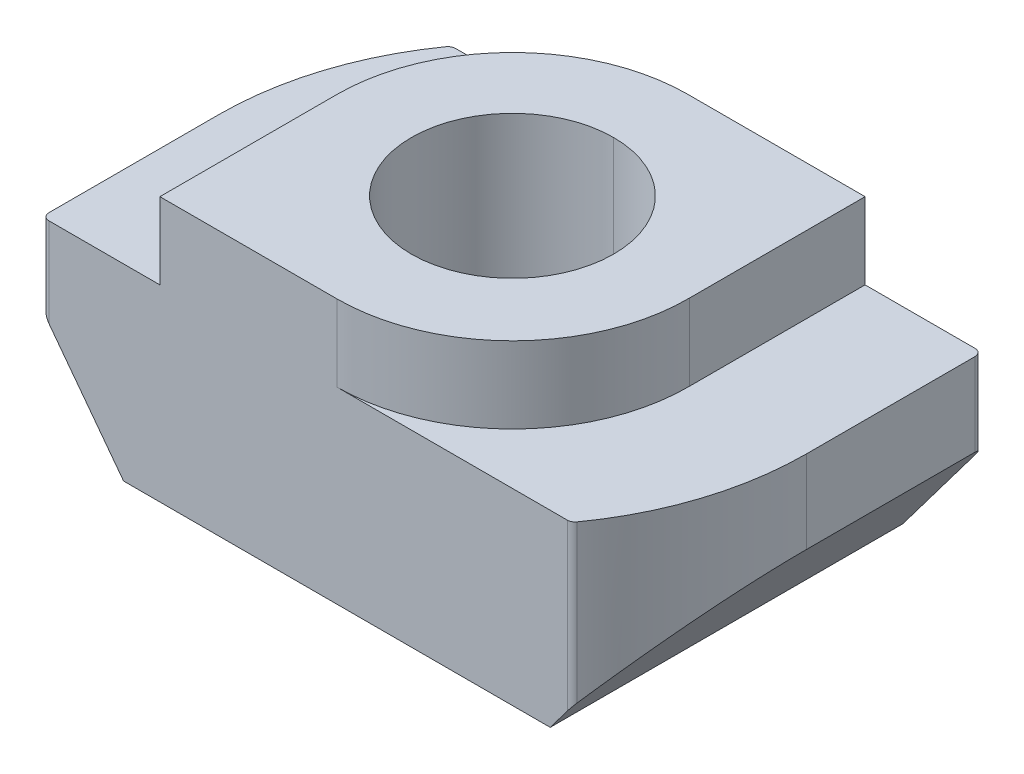
ISO-10303-21;
HEADER;
FILE_DESCRIPTION(('STEP AP214'),'2;1');
FILE_NAME('part.step','',(''),(''),'','','');
FILE_SCHEMA(('AUTOMOTIVE_DESIGN { 1 0 10303 214 1 1 1 1 }'));
ENDSEC;
DATA;
#1=APPLICATION_CONTEXT('core data for automotive mechanical design processes');
#2=APPLICATION_PROTOCOL_DEFINITION('international standard','automotive_design',2000,#1);
#3=PRODUCT_CONTEXT('',#1,'mechanical');
#4=PRODUCT('Part','Part','',(#3));
#5=PRODUCT_RELATED_PRODUCT_CATEGORY('part','',(#4));
#6=PRODUCT_DEFINITION_FORMATION('','',#4);
#7=PRODUCT_DEFINITION_CONTEXT('part definition',#1,'design');
#8=PRODUCT_DEFINITION('design','',#6,#7);
#9=PRODUCT_DEFINITION_SHAPE('','',#8);
#10=(LENGTH_UNIT() NAMED_UNIT(*) SI_UNIT(.MILLI.,.METRE.));
#11=(NAMED_UNIT(*) PLANE_ANGLE_UNIT() SI_UNIT($,.RADIAN.));
#12=(NAMED_UNIT(*) SI_UNIT($,.STERADIAN.) SOLID_ANGLE_UNIT());
#13=UNCERTAINTY_MEASURE_WITH_UNIT(LENGTH_MEASURE(1.E-05),#10,'distance_accuracy_value','');
#14=(GEOMETRIC_REPRESENTATION_CONTEXT(3) GLOBAL_UNCERTAINTY_ASSIGNED_CONTEXT((#13)) GLOBAL_UNIT_ASSIGNED_CONTEXT((#10,
#11,#12)) REPRESENTATION_CONTEXT('',''));
#15=CARTESIAN_POINT('',(0.,0.,0.));
#16=DIRECTION('',(0.,0.,1.));
#17=DIRECTION('',(1.,0.,0.));
#18=AXIS2_PLACEMENT_3D('',#15,#16,#17);
#19=CARTESIAN_POINT('',(-0.024551835244514,-0.00100000000000013,0.));
#20=DIRECTION('',(0.,1.,0.));
#21=DIRECTION('',(0.,0.,1.));
#22=AXIS2_PLACEMENT_3D('',#19,#20,#21);
#23=CYLINDRICAL_SURFACE('',#22,1.72);
#24=DIRECTION('',(0.,1.,0.));
#25=VECTOR('',#24,1.);
#26=CARTESIAN_POINT('',(-0.0245518352445138,-0.00100000000000013,-1.72));
#27=LINE('',#26,#25);
#28=CARTESIAN_POINT('',(-0.0245518352445138,0.,-1.72));
#29=VERTEX_POINT('',#28);
#30=CARTESIAN_POINT('',(-0.0245518352445138,4.5,-1.72));
#31=VERTEX_POINT('',#30);
#32=EDGE_CURVE('E294',#29,#31,#27,.T.);
#33=ORIENTED_EDGE('',*,*,#32,.F.);
#34=CARTESIAN_POINT('',(-0.024551835244514,0.,0.));
#35=DIRECTION('',(0.,1.,0.));
#36=DIRECTION('',(0.,0.,-1.));
#37=AXIS2_PLACEMENT_3D('',#34,#35,#36);
#38=CIRCLE('',#37,1.72);
#39=CARTESIAN_POINT('',(-0.024551835244514,0.,1.72));
#40=VERTEX_POINT('',#39);
#41=EDGE_CURVE('E192',#40,#29,#38,.T.);
#42=ORIENTED_EDGE('',*,*,#41,.F.);
#43=DIRECTION('',(0.,1.,0.));
#44=VECTOR('',#43,1.);
#45=CARTESIAN_POINT('',(-0.024551835244514,-0.00100000000000013,1.72));
#46=LINE('',#45,#44);
#47=CARTESIAN_POINT('',(-0.024551835244514,4.5,1.72));
#48=VERTEX_POINT('',#47);
#49=EDGE_CURVE('E293',#40,#48,#46,.T.);
#50=ORIENTED_EDGE('',*,*,#49,.T.);
#51=CARTESIAN_POINT('',(-0.024551835244514,4.5,0.));
#52=DIRECTION('',(0.,1.,0.));
#53=DIRECTION('',(0.,0.,1.));
#54=AXIS2_PLACEMENT_3D('',#51,#52,#53);
#55=CIRCLE('',#54,1.72);
#56=EDGE_CURVE('E10',#48,#31,#55,.T.);
#57=ORIENTED_EDGE('',*,*,#56,.T.);
#58=EDGE_LOOP('',(#33,#42,#50,#57));
#59=FACE_BOUND('',#58,.T.);
#60=ADVANCED_FACE('F16',(#59),#23,.F.);
#61=CARTESIAN_POINT('',(3.63,0.,-4.65));
#62=DIRECTION('',(-0.79863551004729,0.601815023152053,0.));
#63=DIRECTION('',(0.,0.,1.));
#64=AXIS2_PLACEMENT_3D('',#61,#62,#63);
#65=PLANE('',#64);
#66=DIRECTION('',(0.,0.,-1.));
#67=VECTOR('',#66,1.);
#68=CARTESIAN_POINT('',(3.63,0.,-2.85267364326446));
#69=LINE('',#68,#67);
#70=CARTESIAN_POINT('',(3.63,0.,3.01232635673554));
#71=VERTEX_POINT('',#70);
#72=CARTESIAN_POINT('',(3.63,0.,-2.98767364326446));
#73=VERTEX_POINT('',#72);
#74=EDGE_CURVE('E193',#71,#73,#69,.T.);
#75=ORIENTED_EDGE('',*,*,#74,.T.);
#76=DIRECTION('',(-0.601815023152053,-0.79863551004729,0.));
#77=VECTOR('',#76,1.);
#78=CARTESIAN_POINT('',(5.61330473915061,2.63193428378501,-2.98767364326446));
#79=LINE('',#78,#77);
#80=CARTESIAN_POINT('',(4.85945607210742,1.63154331389991,-2.98767364326446));
#81=VERTEX_POINT('',#80);
#82=EDGE_CURVE('E273',#81,#73,#79,.T.);
#83=ORIENTED_EDGE('',*,*,#82,.F.);
#84=CARTESIAN_POINT('',(4.97945607210742,1.79078869249436,-2.86767364326445));
#85=CARTESIAN_POINT('',(4.97945607210742,1.79078869249435,-2.93796801577968));
#86=CARTESIAN_POINT('',(4.92975044462265,1.72482709693529,-2.98767364326445));
#87=CARTESIAN_POINT('',(4.85945607210742,1.63154331389991,-2.98767364326446));
#88=(BOUNDED_CURVE() B_SPLINE_CURVE(3,(#84,#85,#86,#87),.UNSPECIFIED.,.F.,
.F.) B_SPLINE_CURVE_WITH_KNOTS((4,4),(3.14159265358979,4.7123889803847),
.UNSPECIFIED.) CURVE() GEOMETRIC_REPRESENTATION_ITEM() RATIONAL_B_SPLINE_CURVE((1.,
0.804737854124362,0.804737854124362,1.)) REPRESENTATION_ITEM(''));
#89=CARTESIAN_POINT('',(4.97945607210742,1.79078869249436,-2.86767364326445));
#90=VERTEX_POINT('',#89);
#91=EDGE_CURVE('E251',#90,#81,#88,.T.);
#92=ORIENTED_EDGE('',*,*,#91,.F.);
#93=DIRECTION('',(0.,0.,-1.));
#94=VECTOR('',#93,1.);
#95=CARTESIAN_POINT('',(4.97945607210742,1.79078869249435,0.));
#96=LINE('',#95,#94);
#97=CARTESIAN_POINT('',(4.97945607210742,1.79078869249435,0.));
#98=VERTEX_POINT('',#97);
#99=EDGE_CURVE('E252',#98,#90,#96,.T.);
#100=ORIENTED_EDGE('',*,*,#99,.F.);
#101=CARTESIAN_POINT('',(4.02973652434524,0.530468284644888,2.9559577450269));
#102=CARTESIAN_POINT('',(4.65243275016336,1.35681408655938,2.08693430503643));
#103=CARTESIAN_POINT('',(4.97945607210742,1.79078869249435,1.06908948591827));
#104=CARTESIAN_POINT('',(4.97945607210742,1.79078869249435,0.));
#105=(BOUNDED_CURVE() B_SPLINE_CURVE(3,(#101,#102,#103,#104),.UNSPECIFIED.,.F.,
.F.) B_SPLINE_CURVE_WITH_KNOTS((4,4),(2.51984736449592,3.1415926535898),
.UNSPECIFIED.) CURVE() GEOMETRIC_REPRESENTATION_ITEM() RATIONAL_B_SPLINE_CURVE((1.,
0.968044666372586,0.968044666372586,1.)) REPRESENTATION_ITEM(''));
#106=CARTESIAN_POINT('',(4.02973652434524,0.530468284644888,2.9559577450269));
#107=VERTEX_POINT('',#106);
#108=EDGE_CURVE('E395',#107,#98,#105,.T.);
#109=ORIENTED_EDGE('',*,*,#108,.F.);
#110=CARTESIAN_POINT('',(3.92,0.384842998269915,3.01232635673554));
#111=CARTESIAN_POINT('',(3.96439243811548,0.443753753390169,3.01232635673554));
#112=CARTESIAN_POINT('',(4.0038799388737,0.496155436790089,2.99204272181212));
#113=CARTESIAN_POINT('',(4.02973652434524,0.530468284644888,2.9559577450269));
#114=(BOUNDED_CURVE() B_SPLINE_CURVE(3,(#110,#111,#112,#113),.UNSPECIFIED.,.F.,
.F.) B_SPLINE_CURVE_WITH_KNOTS((4,4),(1.5707963267949,2.51984736449592),
.UNSPECIFIED.) CURVE() GEOMETRIC_REPRESENTATION_ITEM() RATIONAL_B_SPLINE_CURVE((1.,
0.926339746655243,0.926339746655243,1.)) REPRESENTATION_ITEM(''));
#115=CARTESIAN_POINT('',(3.92,0.384842998269915,3.01232635673554));
#116=VERTEX_POINT('',#115);
#117=EDGE_CURVE('E204',#116,#107,#114,.T.);
#118=ORIENTED_EDGE('',*,*,#117,.F.);
#119=DIRECTION('',(0.601815023152053,0.79863551004729,0.));
#120=VECTOR('',#119,1.);
#121=CARTESIAN_POINT('',(5.27305129690785,2.18040271521824,3.01232635673554));
#122=LINE('',#121,#120);
#123=EDGE_CURVE('E210',#71,#116,#122,.T.);
#124=ORIENTED_EDGE('',*,*,#123,.F.);
#125=EDGE_LOOP('',(#75,#83,#92,#100,#109,#118,#124));
#126=FACE_BOUND('',#125,.T.);
#127=ADVANCED_FACE('F432',(#126),#65,.F.);
#128=CARTESIAN_POINT('',(-3.63,0.,-4.65));
#129=DIRECTION('',(0.79863551004729,0.601815023152053,0.));
#130=DIRECTION('',(0.,0.,-1.));
#131=AXIS2_PLACEMENT_3D('',#128,#129,#130);
#132=PLANE('',#131);
#133=DIRECTION('',(0.,0.,1.));
#134=VECTOR('',#133,1.);
#135=CARTESIAN_POINT('',(-5.02054392789258,1.84531411874553,-4.65));
#136=LINE('',#135,#134);
#137=CARTESIAN_POINT('',(-5.02054392789258,1.84531411874553,0.));
#138=VERTEX_POINT('',#137);
#139=CARTESIAN_POINT('',(-5.02054392789258,1.84531411874553,2.89232635673554));
#140=VERTEX_POINT('',#139);
#141=EDGE_CURVE('E226',#138,#140,#136,.T.);
#142=ORIENTED_EDGE('',*,*,#141,.F.);
#143=CARTESIAN_POINT('',(-4.08885480736663,0.608920895991516,-2.930631323799));
#144=CARTESIAN_POINT('',(-4.69993502645744,1.41985173633062,-2.06668938083629));
#145=CARTESIAN_POINT('',(-5.02054392789258,1.84531411874553,-1.05821298185869));
#146=CARTESIAN_POINT('',(-5.02054392789258,1.84531411874553,0.));
#147=(BOUNDED_CURVE() B_SPLINE_CURVE(3,(#143,#144,#145,#146),.UNSPECIFIED.,.F.,
.F.) B_SPLINE_CURVE_WITH_KNOTS((4,4),(2.52597327905867,3.1415926535898),
.UNSPECIFIED.) CURVE() GEOMETRIC_REPRESENTATION_ITEM() RATIONAL_B_SPLINE_CURVE((1.,
0.968666305848477,0.968666305848477,1.)) REPRESENTATION_ITEM(''));
#148=CARTESIAN_POINT('',(-4.08885480736663,0.608920895991516,-2.930631323799));
#149=VERTEX_POINT('',#148);
#150=EDGE_CURVE('E359',#149,#138,#147,.T.);
#151=ORIENTED_EDGE('',*,*,#150,.F.);
#152=CARTESIAN_POINT('',(-3.97863865589294,0.462659122919423,-2.98767364326446));
#153=CARTESIAN_POINT('',(-4.02334074952601,0.52198080479078,-2.98767364326445));
#154=CARTESIAN_POINT('',(-4.06304094414684,0.574664742479666,-2.96712682545126));
#155=CARTESIAN_POINT('',(-4.08885480736663,0.608920895991516,-2.930631323799));
#156=(BOUNDED_CURVE() B_SPLINE_CURVE(3,(#152,#153,#154,#155),.UNSPECIFIED.,.F.,
.F.) B_SPLINE_CURVE_WITH_KNOTS((4,4),(1.5707963267949,2.52597327905868),
.UNSPECIFIED.) CURVE() GEOMETRIC_REPRESENTATION_ITEM() RATIONAL_B_SPLINE_CURVE((1.,
0.925403956045779,0.925403956045779,1.)) REPRESENTATION_ITEM(''));
#157=CARTESIAN_POINT('',(-3.97863865589294,0.462659122919423,-2.98767364326446));
#158=VERTEX_POINT('',#157);
#159=EDGE_CURVE('E258',#158,#149,#156,.T.);
#160=ORIENTED_EDGE('',*,*,#159,.F.);
#161=DIRECTION('',(-0.601815023152053,0.79863551004729,0.));
#162=VECTOR('',#161,1.);
#163=CARTESIAN_POINT('',(-2.09329628946769,-2.03927470142675,-2.98767364326446));
#164=LINE('',#163,#162);
#165=CARTESIAN_POINT('',(-3.63,0.,-2.98767364326446));
#166=VERTEX_POINT('',#165);
#167=EDGE_CURVE('E186',#166,#158,#164,.T.);
#168=ORIENTED_EDGE('',*,*,#167,.F.);
#169=DIRECTION('',(0.,0.,1.));
#170=VECTOR('',#169,1.);
#171=CARTESIAN_POINT('',(-3.63,0.,-2.85267364326446));
#172=LINE('',#171,#170);
#173=CARTESIAN_POINT('',(-3.63,0.,3.01232635673554));
#174=VERTEX_POINT('',#173);
#175=EDGE_CURVE('E177',#166,#174,#172,.T.);
#176=ORIENTED_EDGE('',*,*,#175,.T.);
#177=DIRECTION('',(0.601815023152053,-0.79863551004729,0.));
#178=VECTOR('',#177,1.);
#179=CARTESIAN_POINT('',(-2.43354973171045,-1.58774313285998,3.01232635673554));
#180=LINE('',#179,#178);
#181=CARTESIAN_POINT('',(-4.90054392789258,1.68606874015109,3.01232635673554));
#182=VERTEX_POINT('',#181);
#183=EDGE_CURVE('E182',#182,#174,#180,.T.);
#184=ORIENTED_EDGE('',*,*,#183,.F.);
#185=CARTESIAN_POINT('',(-5.02054392789258,1.84531411874553,2.89232635673554));
#186=CARTESIAN_POINT('',(-5.02054392789258,1.84531411874553,2.96262072925078));
#187=CARTESIAN_POINT('',(-4.97083830040781,1.77935252318647,3.01232635673555));
#188=CARTESIAN_POINT('',(-4.90054392789258,1.68606874015109,3.01232635673554));
#189=(BOUNDED_CURVE() B_SPLINE_CURVE(3,(#185,#186,#187,#188),.UNSPECIFIED.,.F.,
.F.) B_SPLINE_CURVE_WITH_KNOTS((4,4),(3.1415926535898,4.71238898038469),
.UNSPECIFIED.) CURVE() GEOMETRIC_REPRESENTATION_ITEM() RATIONAL_B_SPLINE_CURVE((1.,
0.804737854124365,0.804737854124365,1.)) REPRESENTATION_ITEM(''));
#190=EDGE_CURVE('E220',#140,#182,#189,.T.);
#191=ORIENTED_EDGE('',*,*,#190,.F.);
#192=EDGE_LOOP('',(#142,#151,#160,#168,#176,#184,#191));
#193=FACE_BOUND('',#192,.T.);
#194=ADVANCED_FACE('F180',(#193),#132,.F.);
#195=CARTESIAN_POINT('',(0.,4.5,0.0245518352445135));
#196=DIRECTION('',(0.,1.,0.));
#197=DIRECTION('',(1.,0.,0.));
#198=AXIS2_PLACEMENT_3D('',#195,#196,#197);
#199=PLANE('',#198);
#200=ORIENTED_EDGE('',*,*,#56,.F.);
#201=CARTESIAN_POINT('',(-0.024551835244514,4.5,0.));
#202=DIRECTION('',(0.,1.,0.));
#203=DIRECTION('',(0.,0.,1.));
#204=AXIS2_PLACEMENT_3D('',#201,#202,#203);
#205=CIRCLE('',#204,1.72);
#206=EDGE_CURVE('E289',#31,#48,#205,.T.);
#207=ORIENTED_EDGE('',*,*,#206,.F.);
#208=EDGE_LOOP('',(#200,#207));
#209=FACE_BOUND('',#208,.T.);
#210=CARTESIAN_POINT('',(0.,4.5,0.0245518352445135));
#211=DIRECTION('',(0.,1.,0.));
#212=DIRECTION('',(0.,0.,1.));
#213=AXIS2_PLACEMENT_3D('',#210,#211,#212);
#214=CIRCLE('',#213,2.98777452149104);
#215=CARTESIAN_POINT('',(0.,4.5,3.01232635673554));
#216=VERTEX_POINT('',#215);
#217=CARTESIAN_POINT('',(2.98767364326446,4.5,0.));
#218=VERTEX_POINT('',#217);
#219=EDGE_CURVE('E308',#216,#218,#214,.T.);
#220=ORIENTED_EDGE('',*,*,#219,.T.);
#221=DIRECTION('',(0.,0.,-1.));
#222=VECTOR('',#221,1.);
#223=CARTESIAN_POINT('',(2.98767364326446,4.5,0.));
#224=LINE('',#223,#222);
#225=CARTESIAN_POINT('',(2.98767364326446,4.5,-2.98767364326446));
#226=VERTEX_POINT('',#225);
#227=EDGE_CURVE('E42',#218,#226,#224,.T.);
#228=ORIENTED_EDGE('',*,*,#227,.T.);
#229=DIRECTION('',(-1.,0.,0.));
#230=VECTOR('',#229,1.);
#231=CARTESIAN_POINT('',(2.98767364326446,4.5,-2.98767364326446));
#232=LINE('',#231,#230);
#233=CARTESIAN_POINT('',(0.,4.5,-2.98767364326446));
#234=VERTEX_POINT('',#233);
#235=EDGE_CURVE('E299',#226,#234,#232,.T.);
#236=ORIENTED_EDGE('',*,*,#235,.T.);
#237=CARTESIAN_POINT('',(-0.024551835244514,4.5,0.));
#238=DIRECTION('',(0.,1.,0.));
#239=DIRECTION('',(0.,0.,-1.));
#240=AXIS2_PLACEMENT_3D('',#237,#238,#239);
#241=CIRCLE('',#240,2.98777452149103);
#242=CARTESIAN_POINT('',(-0.024551835244514,4.5,-2.98777452149103));
#243=VERTEX_POINT('',#242);
#244=EDGE_CURVE('E362',#234,#243,#241,.T.);
#245=ORIENTED_EDGE('',*,*,#244,.T.);
#246=CARTESIAN_POINT('',(-0.024551835244514,4.5,0.));
#247=DIRECTION('',(0.,1.,0.));
#248=DIRECTION('',(0.,0.,-1.));
#249=AXIS2_PLACEMENT_3D('',#246,#247,#248);
#250=CIRCLE('',#249,2.98777452149103);
#251=CARTESIAN_POINT('',(-3.01232635673554,4.5,0.));
#252=VERTEX_POINT('',#251);
#253=EDGE_CURVE('E326',#243,#252,#250,.T.);
#254=ORIENTED_EDGE('',*,*,#253,.T.);
#255=DIRECTION('',(0.,0.,1.));
#256=VECTOR('',#255,1.);
#257=CARTESIAN_POINT('',(-3.01232635673554,4.5,3.01232635673555));
#258=LINE('',#257,#256);
#259=CARTESIAN_POINT('',(-3.01232635673554,4.5,3.01232635673555));
#260=VERTEX_POINT('',#259);
#261=EDGE_CURVE('E27',#252,#260,#258,.T.);
#262=ORIENTED_EDGE('',*,*,#261,.T.);
#263=DIRECTION('',(1.,0.,0.));
#264=VECTOR('',#263,1.);
#265=CARTESIAN_POINT('',(0.,4.5,3.01232635673554));
#266=LINE('',#265,#264);
#267=EDGE_CURVE('E246',#260,#216,#266,.T.);
#268=ORIENTED_EDGE('',*,*,#267,.T.);
#269=EDGE_LOOP('',(#220,#228,#236,#245,#254,#262,#268));
#270=FACE_BOUND('',#269,.T.);
#271=ADVANCED_FACE('F524',(#209,#270),#199,.T.);
#272=CARTESIAN_POINT('',(-3.01232635673554,4.5,3.01232635673555));
#273=DIRECTION('',(1.,0.,0.));
#274=DIRECTION('',(0.,1.,0.));
#275=AXIS2_PLACEMENT_3D('',#272,#273,#274);
#276=PLANE('',#275);
#277=DIRECTION('',(0.,0.,1.));
#278=VECTOR('',#277,1.);
#279=CARTESIAN_POINT('',(-3.01232635673554,3.2,3.01232635673555));
#280=LINE('',#279,#278);
#281=CARTESIAN_POINT('',(-3.01232635673554,3.2,0.));
#282=VERTEX_POINT('',#281);
#283=CARTESIAN_POINT('',(-3.01232635673554,3.2,3.01232635673554));
#284=VERTEX_POINT('',#283);
#285=EDGE_CURVE('E333',#282,#284,#280,.T.);
#286=ORIENTED_EDGE('',*,*,#285,.T.);
#287=DIRECTION('',(0.,-1.,0.));
#288=VECTOR('',#287,1.);
#289=CARTESIAN_POINT('',(-3.01232635673554,4.5,3.01232635673555));
#290=LINE('',#289,#288);
#291=EDGE_CURVE('E205',#260,#284,#290,.T.);
#292=ORIENTED_EDGE('',*,*,#291,.F.);
#293=ORIENTED_EDGE('',*,*,#261,.F.);
#294=DIRECTION('',(0.,-1.,0.));
#295=VECTOR('',#294,1.);
#296=CARTESIAN_POINT('',(-3.01232635673554,4.5,0.));
#297=LINE('',#296,#295);
#298=EDGE_CURVE('E338',#252,#282,#297,.T.);
#299=ORIENTED_EDGE('',*,*,#298,.T.);
#300=EDGE_LOOP('',(#286,#292,#293,#299));
#301=FACE_BOUND('',#300,.T.);
#302=ADVANCED_FACE('F429',(#301),#276,.F.);
#303=CARTESIAN_POINT('',(-0.024551835244514,4.5,0.));
#304=DIRECTION('',(0.,-1.,0.));
#305=DIRECTION('',(0.,0.,-1.));
#306=AXIS2_PLACEMENT_3D('',#303,#304,#305);
#307=CYLINDRICAL_SURFACE('',#306,2.98777452149103);
#308=DIRECTION('',(0.,-1.,0.));
#309=VECTOR('',#308,1.);
#310=CARTESIAN_POINT('',(-0.024551835244514,4.5,-2.98777452149103));
#311=LINE('',#310,#309);
#312=CARTESIAN_POINT('',(-0.0245518352445137,3.2,-2.98772408237775));
#313=VERTEX_POINT('',#312);
#314=EDGE_CURVE('E401',#243,#313,#311,.T.);
#315=ORIENTED_EDGE('',*,*,#314,.F.);
#316=ORIENTED_EDGE('',*,*,#244,.F.);
#317=DIRECTION('',(0.,-1.,0.));
#318=VECTOR('',#317,1.);
#319=CARTESIAN_POINT('',(0.,4.5,-2.98767364326446));
#320=LINE('',#319,#318);
#321=CARTESIAN_POINT('',(0.,3.2,-2.98767364326446));
#322=VERTEX_POINT('',#321);
#323=EDGE_CURVE('E304',#234,#322,#320,.T.);
#324=ORIENTED_EDGE('',*,*,#323,.T.);
#325=CARTESIAN_POINT('',(-0.024551835244514,3.2,0.));
#326=DIRECTION('',(0.,1.,0.));
#327=DIRECTION('',(0.00821743242933786,0.,-0.999966236332142));
#328=AXIS2_PLACEMENT_3D('',#325,#326,#327);
#329=CIRCLE('',#328,2.98777452149103);
#330=EDGE_CURVE('E329',#322,#313,#329,.T.);
#331=ORIENTED_EDGE('',*,*,#330,.T.);
#332=EDGE_LOOP('',(#315,#316,#324,#331));
#333=FACE_BOUND('',#332,.T.);
#334=ADVANCED_FACE('F418',(#333),#307,.T.);
#335=CARTESIAN_POINT('',(2.98767364326446,4.5,0.));
#336=DIRECTION('',(-1.,0.,0.));
#337=DIRECTION('',(0.,0.,1.));
#338=AXIS2_PLACEMENT_3D('',#335,#336,#337);
#339=PLANE('',#338);
#340=DIRECTION('',(0.,0.,-1.));
#341=VECTOR('',#340,1.);
#342=CARTESIAN_POINT('',(2.98767364326446,3.2,0.));
#343=LINE('',#342,#341);
#344=CARTESIAN_POINT('',(2.98767364326446,3.2,0.));
#345=VERTEX_POINT('',#344);
#346=CARTESIAN_POINT('',(2.98767364326446,3.2,-2.98767364326446));
#347=VERTEX_POINT('',#346);
#348=EDGE_CURVE('E309',#345,#347,#343,.T.);
#349=ORIENTED_EDGE('',*,*,#348,.T.);
#350=DIRECTION('',(0.,-1.,0.));
#351=VECTOR('',#350,1.);
#352=CARTESIAN_POINT('',(2.98767364326446,4.5,-2.98767364326446));
#353=LINE('',#352,#351);
#354=EDGE_CURVE('E303',#226,#347,#353,.T.);
#355=ORIENTED_EDGE('',*,*,#354,.F.);
#356=ORIENTED_EDGE('',*,*,#227,.F.);
#357=DIRECTION('',(0.,-1.,0.));
#358=VECTOR('',#357,1.);
#359=CARTESIAN_POINT('',(2.98767364326446,4.5,0.));
#360=LINE('',#359,#358);
#361=EDGE_CURVE('E305',#218,#345,#360,.T.);
#362=ORIENTED_EDGE('',*,*,#361,.T.);
#363=EDGE_LOOP('',(#349,#355,#356,#362));
#364=FACE_BOUND('',#363,.T.);
#365=ADVANCED_FACE('F428',(#364),#339,.F.);
#366=CARTESIAN_POINT('',(0.,4.5,0.0245518352445135));
#367=DIRECTION('',(0.,-1.,0.));
#368=DIRECTION('',(0.,0.,-1.));
#369=AXIS2_PLACEMENT_3D('',#366,#367,#368);
#370=CYLINDRICAL_SURFACE('',#369,2.98777452149104);
#371=CARTESIAN_POINT('',(0.,3.2,0.0245518352445135));
#372=DIRECTION('',(0.,1.,0.));
#373=DIRECTION('',(0.,0.,1.));
#374=AXIS2_PLACEMENT_3D('',#371,#372,#373);
#375=CIRCLE('',#374,2.98777452149104);
#376=CARTESIAN_POINT('',(0.,3.2,3.01232635673554));
#377=VERTEX_POINT('',#376);
#378=EDGE_CURVE('E342',#377,#345,#375,.T.);
#379=ORIENTED_EDGE('',*,*,#378,.T.);
#380=ORIENTED_EDGE('',*,*,#361,.F.);
#381=ORIENTED_EDGE('',*,*,#219,.F.);
#382=DIRECTION('',(0.,-1.,0.));
#383=VECTOR('',#382,1.);
#384=CARTESIAN_POINT('',(0.,4.5,3.01232635673554));
#385=LINE('',#384,#383);
#386=EDGE_CURVE('E285',#216,#377,#385,.T.);
#387=ORIENTED_EDGE('',*,*,#386,.T.);
#388=EDGE_LOOP('',(#379,#380,#381,#387));
#389=FACE_BOUND('',#388,.T.);
#390=ADVANCED_FACE('F442',(#389),#370,.T.);
#391=CARTESIAN_POINT('',(-3.97863865589294,0.,-2.85267364326446));
#392=DIRECTION('',(0.,-1.,0.));
#393=DIRECTION('',(0.,0.,-1.));
#394=AXIS2_PLACEMENT_3D('',#391,#392,#393);
#395=PLANE('',#394);
#396=ORIENTED_EDGE('',*,*,#41,.T.);
#397=CARTESIAN_POINT('',(-0.024551835244514,0.,0.));
#398=DIRECTION('',(0.,1.,0.));
#399=DIRECTION('',(0.,0.,-1.));
#400=AXIS2_PLACEMENT_3D('',#397,#398,#399);
#401=CIRCLE('',#400,1.72);
#402=EDGE_CURVE('E295',#29,#40,#401,.T.);
#403=ORIENTED_EDGE('',*,*,#402,.T.);
#404=EDGE_LOOP('',(#396,#403));
#405=FACE_BOUND('',#404,.T.);
#406=ORIENTED_EDGE('',*,*,#74,.F.);
#407=DIRECTION('',(1.,0.,0.));
#408=VECTOR('',#407,1.);
#409=CARTESIAN_POINT('',(3.92,0.,3.01232635673554));
#410=LINE('',#409,#408);
#411=EDGE_CURVE('E199',#174,#71,#410,.T.);
#412=ORIENTED_EDGE('',*,*,#411,.F.);
#413=ORIENTED_EDGE('',*,*,#175,.F.);
#414=DIRECTION('',(-1.,0.,0.));
#415=VECTOR('',#414,1.);
#416=CARTESIAN_POINT('',(4.85945607210742,0.,-2.98767364326446));
#417=LINE('',#416,#415);
#418=EDGE_CURVE('E280',#73,#166,#417,.T.);
#419=ORIENTED_EDGE('',*,*,#418,.F.);
#420=EDGE_LOOP('',(#406,#412,#413,#419));
#421=FACE_BOUND('',#420,.T.);
#422=ADVANCED_FACE('F207',(#405,#421),#395,.T.);
#423=CARTESIAN_POINT('',(4.85945607210742,3.2,-2.98767364326446));
#424=DIRECTION('',(0.,0.,1.));
#425=DIRECTION('',(1.,0.,0.));
#426=AXIS2_PLACEMENT_3D('',#423,#424,#425);
#427=PLANE('',#426);
#428=DIRECTION('',(0.,-1.,0.));
#429=VECTOR('',#428,1.);
#430=CARTESIAN_POINT('',(4.85945607210742,3.2,-2.98767364326446));
#431=LINE('',#430,#429);
#432=CARTESIAN_POINT('',(4.85945607210742,3.2,-2.98767364326446));
#433=VERTEX_POINT('',#432);
#434=EDGE_CURVE('E281',#433,#81,#431,.T.);
#435=ORIENTED_EDGE('',*,*,#434,.T.);
#436=ORIENTED_EDGE('',*,*,#82,.T.);
#437=ORIENTED_EDGE('',*,*,#418,.T.);
#438=ORIENTED_EDGE('',*,*,#167,.T.);
#439=DIRECTION('',(0.,-1.,0.));
#440=VECTOR('',#439,1.);
#441=CARTESIAN_POINT('',(-3.97863865589294,3.2,-2.98767364326446));
#442=LINE('',#441,#440);
#443=CARTESIAN_POINT('',(-3.97863865589294,3.2,-2.98767364326446));
#444=VERTEX_POINT('',#443);
#445=EDGE_CURVE('E265',#444,#158,#442,.T.);
#446=ORIENTED_EDGE('',*,*,#445,.F.);
#447=DIRECTION('',(-1.,0.,0.));
#448=VECTOR('',#447,1.);
#449=CARTESIAN_POINT('',(4.85945607210742,3.2,-2.98767364326446));
#450=LINE('',#449,#448);
#451=CARTESIAN_POINT('',(-0.0491036704889641,3.2,-2.98767364326446));
#452=VERTEX_POINT('',#451);
#453=EDGE_CURVE('E337',#452,#444,#450,.T.);
#454=ORIENTED_EDGE('',*,*,#453,.F.);
#455=CARTESIAN_POINT('',(-0.024551835244514,3.2,0.));
#456=DIRECTION('',(0.,1.,0.));
#457=DIRECTION('',(0.,0.,-1.));
#458=AXIS2_PLACEMENT_3D('',#455,#456,#457);
#459=CIRCLE('',#458,2.98777452149103);
#460=EDGE_CURVE('E405',#313,#452,#459,.T.);
#461=ORIENTED_EDGE('',*,*,#460,.F.);
#462=ORIENTED_EDGE('',*,*,#330,.F.);
#463=ORIENTED_EDGE('',*,*,#323,.F.);
#464=ORIENTED_EDGE('',*,*,#235,.F.);
#465=ORIENTED_EDGE('',*,*,#354,.T.);
#466=DIRECTION('',(-1.,0.,0.));
#467=VECTOR('',#466,1.);
#468=CARTESIAN_POINT('',(4.85945607210742,3.2,-2.98767364326446));
#469=LINE('',#468,#467);
#470=EDGE_CURVE('E313',#433,#347,#469,.T.);
#471=ORIENTED_EDGE('',*,*,#470,.F.);
#472=EDGE_LOOP('',(#435,#436,#437,#438,#446,#454,#461,#462,#463,#464,#465,#471));
#473=FACE_BOUND('',#472,.T.);
#474=ADVANCED_FACE('F436',(#473),#427,.F.);
#475=CARTESIAN_POINT('',(4.85945607210742,3.2,-2.86767364326445));
#476=DIRECTION('',(0.,-1.,0.));
#477=DIRECTION('',(0.,0.,-1.));
#478=AXIS2_PLACEMENT_3D('',#475,#476,#477);
#479=CYLINDRICAL_SURFACE('',#478,0.12);
#480=DIRECTION('',(0.,-1.,0.));
#481=VECTOR('',#480,1.);
#482=CARTESIAN_POINT('',(4.97945607210742,3.2,-2.86767364326445));
#483=LINE('',#482,#481);
#484=CARTESIAN_POINT('',(4.97945607210742,3.2,-2.86767364326445));
#485=VERTEX_POINT('',#484);
#486=EDGE_CURVE('E247',#485,#90,#483,.T.);
#487=ORIENTED_EDGE('',*,*,#486,.T.);
#488=ORIENTED_EDGE('',*,*,#91,.T.);
#489=ORIENTED_EDGE('',*,*,#434,.F.);
#490=CARTESIAN_POINT('',(4.85945607210742,3.2,-2.86767364326445));
#491=DIRECTION('',(0.,1.,0.));
#492=DIRECTION('',(0.,0.,1.));
#493=AXIS2_PLACEMENT_3D('',#490,#491,#492);
#494=CIRCLE('',#493,0.12);
#495=EDGE_CURVE('E235',#485,#433,#494,.T.);
#496=ORIENTED_EDGE('',*,*,#495,.F.);
#497=EDGE_LOOP('',(#487,#488,#489,#496));
#498=FACE_BOUND('',#497,.T.);
#499=ADVANCED_FACE('F440',(#498),#479,.T.);
#500=CARTESIAN_POINT('',(4.97945607210742,3.2,0.));
#501=DIRECTION('',(-1.,0.,0.));
#502=DIRECTION('',(0.,0.,1.));
#503=AXIS2_PLACEMENT_3D('',#500,#501,#502);
#504=PLANE('',#503);
#505=DIRECTION('',(0.,-1.,0.));
#506=VECTOR('',#505,1.);
#507=CARTESIAN_POINT('',(4.97945607210742,3.2,0.));
#508=LINE('',#507,#506);
#509=CARTESIAN_POINT('',(4.97945607210742,3.2,0.));
#510=VERTEX_POINT('',#509);
#511=EDGE_CURVE('E355',#510,#98,#508,.T.);
#512=ORIENTED_EDGE('',*,*,#511,.T.);
#513=ORIENTED_EDGE('',*,*,#99,.T.);
#514=ORIENTED_EDGE('',*,*,#486,.F.);
#515=DIRECTION('',(0.,0.,-1.));
#516=VECTOR('',#515,1.);
#517=CARTESIAN_POINT('',(4.97945607210742,3.2,0.));
#518=LINE('',#517,#516);
#519=EDGE_CURVE('E231',#510,#485,#518,.T.);
#520=ORIENTED_EDGE('',*,*,#519,.F.);
#521=EDGE_LOOP('',(#512,#513,#514,#520));
#522=FACE_BOUND('',#521,.T.);
#523=ADVANCED_FACE('F509',(#522),#504,.F.);
#524=CARTESIAN_POINT('',(-0.0955439278925783,3.2,0.));
#525=DIRECTION('',(0.,-1.,0.));
#526=DIRECTION('',(0.,0.,-1.));
#527=AXIS2_PLACEMENT_3D('',#524,#525,#526);
#528=CYLINDRICAL_SURFACE('',#527,5.075);
#529=DIRECTION('',(0.,-1.,0.));
#530=VECTOR('',#529,1.);
#531=CARTESIAN_POINT('',(4.02973652434524,3.2,2.9559577450269));
#532=LINE('',#531,#530);
#533=CARTESIAN_POINT('',(4.02973652434524,3.2,2.9559577450269));
#534=VERTEX_POINT('',#533);
#535=EDGE_CURVE('E590',#534,#107,#532,.T.);
#536=ORIENTED_EDGE('',*,*,#535,.T.);
#537=ORIENTED_EDGE('',*,*,#108,.T.);
#538=ORIENTED_EDGE('',*,*,#511,.F.);
#539=CARTESIAN_POINT('',(-0.0955439278925783,3.2,0.));
#540=DIRECTION('',(0.,1.,0.));
#541=DIRECTION('',(0.,0.,1.));
#542=AXIS2_PLACEMENT_3D('',#539,#540,#541);
#543=CIRCLE('',#542,5.075);
#544=EDGE_CURVE('E236',#534,#510,#543,.T.);
#545=ORIENTED_EDGE('',*,*,#544,.F.);
#546=EDGE_LOOP('',(#536,#537,#538,#545));
#547=FACE_BOUND('',#546,.T.);
#548=ADVANCED_FACE('F513',(#547),#528,.T.);
#549=CARTESIAN_POINT('',(3.92,3.2,2.87732635673554));
#550=DIRECTION('',(0.,-1.,0.));
#551=DIRECTION('',(0.,0.,-1.));
#552=AXIS2_PLACEMENT_3D('',#549,#550,#551);
#553=CYLINDRICAL_SURFACE('',#552,0.135);
#554=DIRECTION('',(0.,-1.,0.));
#555=VECTOR('',#554,1.);
#556=CARTESIAN_POINT('',(3.92,3.2,3.01232635673554));
#557=LINE('',#556,#555);
#558=CARTESIAN_POINT('',(3.92,3.2,3.01232635673554));
#559=VERTEX_POINT('',#558);
#560=EDGE_CURVE('E217',#559,#116,#557,.T.);
#561=ORIENTED_EDGE('',*,*,#560,.T.);
#562=ORIENTED_EDGE('',*,*,#117,.T.);
#563=ORIENTED_EDGE('',*,*,#535,.F.);
#564=CARTESIAN_POINT('',(3.92,3.2,2.87732635673554));
#565=DIRECTION('',(0.,1.,0.));
#566=DIRECTION('',(0.,0.,-1.));
#567=AXIS2_PLACEMENT_3D('',#564,#565,#566);
#568=CIRCLE('',#567,0.135);
#569=EDGE_CURVE('E224',#559,#534,#568,.T.);
#570=ORIENTED_EDGE('',*,*,#569,.F.);
#571=EDGE_LOOP('',(#561,#562,#563,#570));
#572=FACE_BOUND('',#571,.T.);
#573=ADVANCED_FACE('F522',(#572),#553,.T.);
#574=CARTESIAN_POINT('',(3.92,3.2,3.01232635673554));
#575=DIRECTION('',(0.,0.,-1.));
#576=DIRECTION('',(0.,-1.,0.));
#577=AXIS2_PLACEMENT_3D('',#574,#575,#576);
#578=PLANE('',#577);
#579=ORIENTED_EDGE('',*,*,#411,.T.);
#580=ORIENTED_EDGE('',*,*,#123,.T.);
#581=ORIENTED_EDGE('',*,*,#560,.F.);
#582=DIRECTION('',(1.,0.,0.));
#583=VECTOR('',#582,1.);
#584=CARTESIAN_POINT('',(3.92,3.2,3.01232635673554));
#585=LINE('',#584,#583);
#586=EDGE_CURVE('E339',#377,#559,#585,.T.);
#587=ORIENTED_EDGE('',*,*,#586,.F.);
#588=ORIENTED_EDGE('',*,*,#386,.F.);
#589=ORIENTED_EDGE('',*,*,#267,.F.);
#590=ORIENTED_EDGE('',*,*,#291,.T.);
#591=DIRECTION('',(1.,0.,0.));
#592=VECTOR('',#591,1.);
#593=CARTESIAN_POINT('',(3.92,3.2,3.01232635673554));
#594=LINE('',#593,#592);
#595=CARTESIAN_POINT('',(-4.90054392789258,3.2,3.01232635673554));
#596=VERTEX_POINT('',#595);
#597=EDGE_CURVE('E257',#596,#284,#594,.T.);
#598=ORIENTED_EDGE('',*,*,#597,.F.);
#599=DIRECTION('',(0.,-1.,0.));
#600=VECTOR('',#599,1.);
#601=CARTESIAN_POINT('',(-4.90054392789258,3.2,3.01232635673554));
#602=LINE('',#601,#600);
#603=EDGE_CURVE('E201',#596,#182,#602,.T.);
#604=ORIENTED_EDGE('',*,*,#603,.T.);
#605=ORIENTED_EDGE('',*,*,#183,.T.);
#606=EDGE_LOOP('',(#579,#580,#581,#587,#588,#589,#590,#598,#604,#605));
#607=FACE_BOUND('',#606,.T.);
#608=ADVANCED_FACE('F197',(#607),#578,.F.);
#609=CARTESIAN_POINT('',(-4.90054392789258,3.2,2.89232635673554));
#610=DIRECTION('',(0.,-1.,0.));
#611=DIRECTION('',(0.,0.,-1.));
#612=AXIS2_PLACEMENT_3D('',#609,#610,#611);
#613=CYLINDRICAL_SURFACE('',#612,0.12);
#614=DIRECTION('',(0.,-1.,0.));
#615=VECTOR('',#614,1.);
#616=CARTESIAN_POINT('',(-5.02054392789258,3.2,2.89232635673554));
#617=LINE('',#616,#615);
#618=CARTESIAN_POINT('',(-5.02054392789258,3.2,2.89232635673554));
#619=VERTEX_POINT('',#618);
#620=EDGE_CURVE('E229',#619,#140,#617,.T.);
#621=ORIENTED_EDGE('',*,*,#620,.T.);
#622=ORIENTED_EDGE('',*,*,#190,.T.);
#623=ORIENTED_EDGE('',*,*,#603,.F.);
#624=CARTESIAN_POINT('',(-4.90054392789258,3.2,2.89232635673554));
#625=DIRECTION('',(0.,1.,0.));
#626=DIRECTION('',(0.,0.,-1.));
#627=AXIS2_PLACEMENT_3D('',#624,#625,#626);
#628=CIRCLE('',#627,0.12);
#629=EDGE_CURVE('E253',#619,#596,#628,.T.);
#630=ORIENTED_EDGE('',*,*,#629,.F.);
#631=EDGE_LOOP('',(#621,#622,#623,#630));
#632=FACE_BOUND('',#631,.T.);
#633=ADVANCED_FACE('F537',(#632),#613,.T.);
#634=CARTESIAN_POINT('',(-5.02054392789258,3.2,2.89232635673554));
#635=DIRECTION('',(1.,0.,0.));
#636=DIRECTION('',(0.,1.,0.));
#637=AXIS2_PLACEMENT_3D('',#634,#635,#636);
#638=PLANE('',#637);
#639=DIRECTION('',(0.,-1.,0.));
#640=VECTOR('',#639,1.);
#641=CARTESIAN_POINT('',(-5.02054392789258,3.2,0.));
#642=LINE('',#641,#640);
#643=CARTESIAN_POINT('',(-5.02054392789258,3.2,0.));
#644=VERTEX_POINT('',#643);
#645=EDGE_CURVE('E230',#644,#138,#642,.T.);
#646=ORIENTED_EDGE('',*,*,#645,.T.);
#647=ORIENTED_EDGE('',*,*,#141,.T.);
#648=ORIENTED_EDGE('',*,*,#620,.F.);
#649=DIRECTION('',(0.,0.,1.));
#650=VECTOR('',#649,1.);
#651=CARTESIAN_POINT('',(-5.02054392789258,3.2,2.89232635673554));
#652=LINE('',#651,#650);
#653=EDGE_CURVE('E241',#644,#619,#652,.T.);
#654=ORIENTED_EDGE('',*,*,#653,.F.);
#655=EDGE_LOOP('',(#646,#647,#648,#654));
#656=FACE_BOUND('',#655,.T.);
#657=ADVANCED_FACE('F18',(#656),#638,.F.);
#658=CARTESIAN_POINT('',(0.0544560721074221,3.2,0.));
#659=DIRECTION('',(0.,-1.,0.));
#660=DIRECTION('',(0.,0.,-1.));
#661=AXIS2_PLACEMENT_3D('',#658,#659,#660);
#662=CYLINDRICAL_SURFACE('',#661,5.075);
#663=DIRECTION('',(0.,-1.,0.));
#664=VECTOR('',#663,1.);
#665=CARTESIAN_POINT('',(-4.08885480736663,3.2,-2.930631323799));
#666=LINE('',#665,#664);
#667=CARTESIAN_POINT('',(-4.08885480736663,3.2,-2.930631323799));
#668=VERTEX_POINT('',#667);
#669=EDGE_CURVE('E264',#668,#149,#666,.T.);
#670=ORIENTED_EDGE('',*,*,#669,.T.);
#671=ORIENTED_EDGE('',*,*,#150,.T.);
#672=ORIENTED_EDGE('',*,*,#645,.F.);
#673=CARTESIAN_POINT('',(0.0544560721074221,3.2,0.));
#674=DIRECTION('',(0.,1.,0.));
#675=DIRECTION('',(0.,0.,-1.));
#676=AXIS2_PLACEMENT_3D('',#673,#674,#675);
#677=CIRCLE('',#676,5.075);
#678=EDGE_CURVE('E237',#668,#644,#677,.T.);
#679=ORIENTED_EDGE('',*,*,#678,.F.);
#680=EDGE_LOOP('',(#670,#671,#672,#679));
#681=FACE_BOUND('',#680,.T.);
#682=ADVANCED_FACE('F430',(#681),#662,.T.);
#683=CARTESIAN_POINT('',(-3.97863865589294,3.2,-2.85267364326446));
#684=DIRECTION('',(0.,-1.,0.));
#685=DIRECTION('',(0.,0.,-1.));
#686=AXIS2_PLACEMENT_3D('',#683,#684,#685);
#687=CYLINDRICAL_SURFACE('',#686,0.135);
#688=ORIENTED_EDGE('',*,*,#445,.T.);
#689=ORIENTED_EDGE('',*,*,#159,.T.);
#690=ORIENTED_EDGE('',*,*,#669,.F.);
#691=CARTESIAN_POINT('',(-3.97863865589294,3.2,-2.85267364326446));
#692=DIRECTION('',(0.,1.,0.));
#693=DIRECTION('',(0.,0.,-1.));
#694=AXIS2_PLACEMENT_3D('',#691,#692,#693);
#695=CIRCLE('',#694,0.135);
#696=EDGE_CURVE('E242',#444,#668,#695,.T.);
#697=ORIENTED_EDGE('',*,*,#696,.F.);
#698=EDGE_LOOP('',(#688,#689,#690,#697));
#699=FACE_BOUND('',#698,.T.);
#700=ADVANCED_FACE('F518',(#699),#687,.T.);
#701=CARTESIAN_POINT('',(-3.97863865589294,3.2,-2.85267364326446));
#702=DIRECTION('',(0.,-1.,0.));
#703=DIRECTION('',(0.,0.,-1.));
#704=AXIS2_PLACEMENT_3D('',#701,#702,#703);
#705=PLANE('',#704);
#706=ORIENTED_EDGE('',*,*,#378,.F.);
#707=ORIENTED_EDGE('',*,*,#586,.T.);
#708=ORIENTED_EDGE('',*,*,#569,.T.);
#709=ORIENTED_EDGE('',*,*,#544,.T.);
#710=ORIENTED_EDGE('',*,*,#519,.T.);
#711=ORIENTED_EDGE('',*,*,#495,.T.);
#712=ORIENTED_EDGE('',*,*,#470,.T.);
#713=ORIENTED_EDGE('',*,*,#348,.F.);
#714=EDGE_LOOP('',(#706,#707,#708,#709,#710,#711,#712,#713));
#715=FACE_BOUND('',#714,.T.);
#716=ADVANCED_FACE('F515',(#715),#705,.F.);
#717=CARTESIAN_POINT('',(-3.97863865589294,3.2,-2.85267364326446));
#718=DIRECTION('',(0.,-1.,0.));
#719=DIRECTION('',(0.,0.,-1.));
#720=AXIS2_PLACEMENT_3D('',#717,#718,#719);
#721=PLANE('',#720);
#722=ORIENTED_EDGE('',*,*,#285,.F.);
#723=CARTESIAN_POINT('',(-0.024551835244514,3.2,0.));
#724=DIRECTION('',(0.,1.,0.));
#725=DIRECTION('',(0.,0.,-1.));
#726=AXIS2_PLACEMENT_3D('',#723,#724,#725);
#727=CIRCLE('',#726,2.98777452149103);
#728=EDGE_CURVE('E391',#452,#282,#727,.T.);
#729=ORIENTED_EDGE('',*,*,#728,.F.);
#730=ORIENTED_EDGE('',*,*,#453,.T.);
#731=ORIENTED_EDGE('',*,*,#696,.T.);
#732=ORIENTED_EDGE('',*,*,#678,.T.);
#733=ORIENTED_EDGE('',*,*,#653,.T.);
#734=ORIENTED_EDGE('',*,*,#629,.T.);
#735=ORIENTED_EDGE('',*,*,#597,.T.);
#736=EDGE_LOOP('',(#722,#729,#730,#731,#732,#733,#734,#735));
#737=FACE_BOUND('',#736,.T.);
#738=ADVANCED_FACE('F493',(#737),#721,.F.);
#739=CARTESIAN_POINT('',(-0.024551835244514,4.5,0.));
#740=DIRECTION('',(0.,-1.,0.));
#741=DIRECTION('',(0.,0.,-1.));
#742=AXIS2_PLACEMENT_3D('',#739,#740,#741);
#743=CYLINDRICAL_SURFACE('',#742,2.98777452149103);
#744=ORIENTED_EDGE('',*,*,#253,.F.);
#745=ORIENTED_EDGE('',*,*,#314,.T.);
#746=ORIENTED_EDGE('',*,*,#460,.T.);
#747=ORIENTED_EDGE('',*,*,#728,.T.);
#748=ORIENTED_EDGE('',*,*,#298,.F.);
#749=EDGE_LOOP('',(#744,#745,#746,#747,#748));
#750=FACE_BOUND('',#749,.T.);
#751=ADVANCED_FACE('F478',(#750),#743,.T.);
#752=CARTESIAN_POINT('',(-0.024551835244514,-0.00100000000000013,0.));
#753=DIRECTION('',(0.,1.,0.));
#754=DIRECTION('',(0.,0.,1.));
#755=AXIS2_PLACEMENT_3D('',#752,#753,#754);
#756=CYLINDRICAL_SURFACE('',#755,1.72);
#757=ORIENTED_EDGE('',*,*,#402,.F.);
#758=ORIENTED_EDGE('',*,*,#32,.T.);
#759=ORIENTED_EDGE('',*,*,#206,.T.);
#760=ORIENTED_EDGE('',*,*,#49,.F.);
#761=EDGE_LOOP('',(#757,#758,#759,#760));
#762=FACE_BOUND('',#761,.T.);
#763=ADVANCED_FACE('F492',(#762),#756,.F.);
#764=CLOSED_SHELL('',(#60,#127,#194,#271,#302,#334,#365,#390,#422,#474,#499,#523,#548,#573,#608,
#633,#657,#682,#700,#716,#738,#751,#763));
#765=MANIFOLD_SOLID_BREP('B1',#764);
#766=ADVANCED_BREP_SHAPE_REPRESENTATION('',(#18,#765),#14);
#767=SHAPE_DEFINITION_REPRESENTATION(#9,#766);
ENDSEC;
END-ISO-10303-21;
